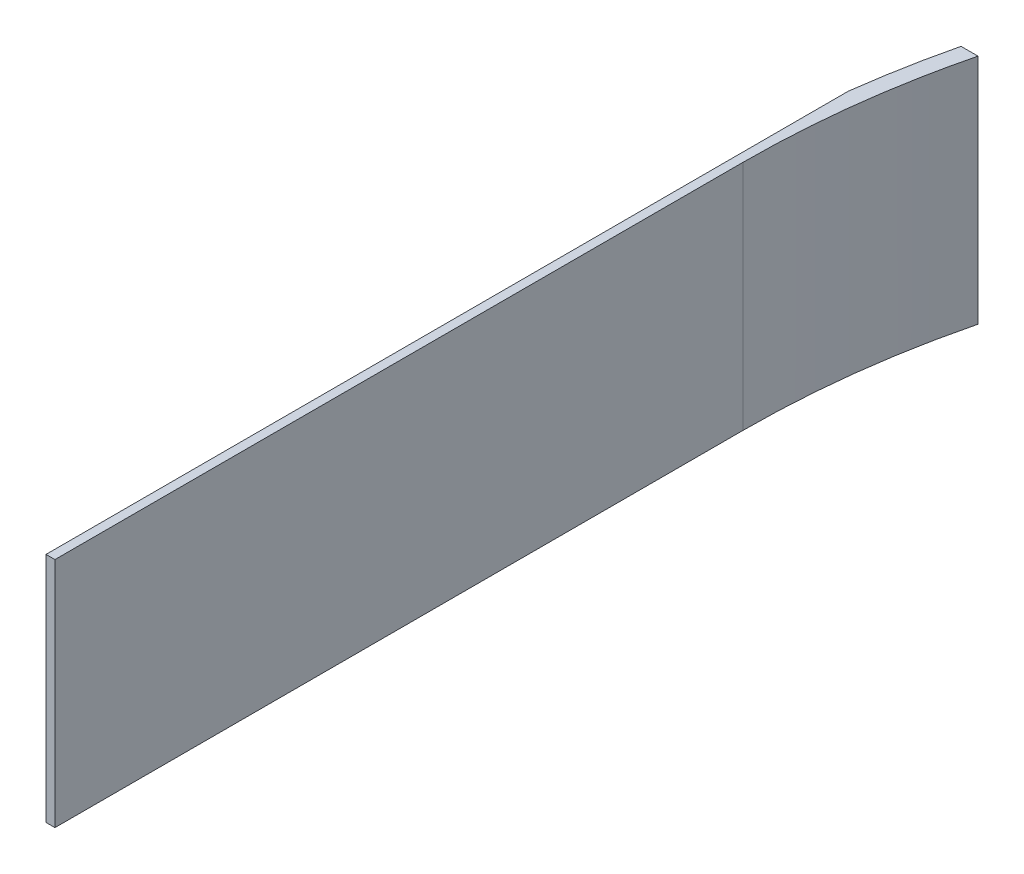
ISO-10303-21;
HEADER;
FILE_DESCRIPTION(('STEP AP214'),'2;1');
FILE_NAME('part.step','',(''),(''),'','','');
FILE_SCHEMA(('AUTOMOTIVE_DESIGN { 1 0 10303 214 1 1 1 1 }'));
ENDSEC;
DATA;
#1=APPLICATION_CONTEXT('core data for automotive mechanical design processes');
#2=APPLICATION_PROTOCOL_DEFINITION('international standard','automotive_design',2000,#1);
#3=PRODUCT_CONTEXT('',#1,'mechanical');
#4=PRODUCT('Part','Part','',(#3));
#5=PRODUCT_RELATED_PRODUCT_CATEGORY('part','',(#4));
#6=PRODUCT_DEFINITION_FORMATION('','',#4);
#7=PRODUCT_DEFINITION_CONTEXT('part definition',#1,'design');
#8=PRODUCT_DEFINITION('design','',#6,#7);
#9=PRODUCT_DEFINITION_SHAPE('','',#8);
#10=(LENGTH_UNIT() NAMED_UNIT(*) SI_UNIT(.MILLI.,.METRE.));
#11=(NAMED_UNIT(*) PLANE_ANGLE_UNIT() SI_UNIT($,.RADIAN.));
#12=(NAMED_UNIT(*) SI_UNIT($,.STERADIAN.) SOLID_ANGLE_UNIT());
#13=UNCERTAINTY_MEASURE_WITH_UNIT(LENGTH_MEASURE(1.E-05),#10,'distance_accuracy_value','');
#14=(GEOMETRIC_REPRESENTATION_CONTEXT(3) GLOBAL_UNCERTAINTY_ASSIGNED_CONTEXT((#13)) GLOBAL_UNIT_ASSIGNED_CONTEXT((#10,
#11,#12)) REPRESENTATION_CONTEXT('',''));
#15=CARTESIAN_POINT('',(0.,0.,0.));
#16=DIRECTION('',(0.,0.,1.));
#17=DIRECTION('',(1.,0.,0.));
#18=AXIS2_PLACEMENT_3D('',#15,#16,#17);
#19=CARTESIAN_POINT('',(-300.,0.,0.));
#20=DIRECTION('',(1.,0.,0.));
#21=DIRECTION('',(0.,0.,-1.));
#22=AXIS2_PLACEMENT_3D('',#19,#20,#21);
#23=PLANE('',#22);
#24=DIRECTION('',(0.,-1.,0.));
#25=VECTOR('',#24,1.);
#26=CARTESIAN_POINT('',(-300.,0.,0.));
#27=LINE('',#26,#25);
#28=CARTESIAN_POINT('',(-300.,116.56754481445,0.));
#29=VERTEX_POINT('',#28);
#30=CARTESIAN_POINT('',(-300.,77.7625120885841,0.));
#31=VERTEX_POINT('',#30);
#32=EDGE_CURVE('E11',#29,#31,#27,.T.);
#33=ORIENTED_EDGE('',*,*,#32,.F.);
#34=DIRECTION('',(0.,0.,1.));
#35=VECTOR('',#34,1.);
#36=CARTESIAN_POINT('',(-300.,116.56754481445,230.000026632189));
#37=LINE('',#36,#35);
#38=CARTESIAN_POINT('',(-300.,116.56754481445,-134.047206857874));
#39=VERTEX_POINT('',#38);
#40=EDGE_CURVE('E109',#39,#29,#37,.T.);
#41=ORIENTED_EDGE('',*,*,#40,.F.);
#42=DIRECTION('',(0.,-1.,0.));
#43=VECTOR('',#42,1.);
#44=CARTESIAN_POINT('',(-300.,103.299199319842,-134.047206857874));
#45=LINE('',#44,#43);
#46=CARTESIAN_POINT('',(-300.,80.1625120885841,-134.047206857874));
#47=VERTEX_POINT('',#46);
#48=EDGE_CURVE('E97',#47,#39,#45,.F.);
#49=ORIENTED_EDGE('',*,*,#48,.F.);
#50=DIRECTION('',(0.,0.,-1.));
#51=VECTOR('',#50,1.);
#52=CARTESIAN_POINT('',(-300.,80.1625120885842,-208.339640738144));
#53=LINE('',#52,#51);
#54=CARTESIAN_POINT('',(-300.,80.1625120885842,-149.999999999977));
#55=VERTEX_POINT('',#54);
#56=EDGE_CURVE('E140',#47,#55,#53,.T.);
#57=ORIENTED_EDGE('',*,*,#56,.T.);
#58=DIRECTION('',(0.,-1.,0.));
#59=VECTOR('',#58,1.);
#60=CARTESIAN_POINT('',(-300.,0.,-150.));
#61=LINE('',#60,#59);
#62=CARTESIAN_POINT('',(-300.,77.7625120885841,-149.999999999977));
#63=VERTEX_POINT('',#62);
#64=EDGE_CURVE('E38',#55,#63,#61,.T.);
#65=ORIENTED_EDGE('',*,*,#64,.T.);
#66=DIRECTION('',(0.,0.,-1.));
#67=VECTOR('',#66,1.);
#68=CARTESIAN_POINT('',(-300.,77.7625120885841,-149.499973367811));
#69=LINE('',#68,#67);
#70=EDGE_CURVE('E150',#31,#63,#69,.T.);
#71=ORIENTED_EDGE('',*,*,#70,.F.);
#72=EDGE_LOOP('',(#33,#41,#49,#57,#65,#71));
#73=FACE_BOUND('',#72,.T.);
#74=ADVANCED_FACE('F34',(#73),#23,.F.);
#75=CARTESIAN_POINT('',(0.,0.,-150.));
#76=DIRECTION('',(0.,0.,1.));
#77=DIRECTION('',(1.,0.,0.));
#78=AXIS2_PLACEMENT_3D('',#75,#76,#77);
#79=PLANE('',#78);
#80=ORIENTED_EDGE('',*,*,#64,.F.);
#81=DIRECTION('',(1.,0.,0.));
#82=VECTOR('',#81,1.);
#83=CARTESIAN_POINT('',(-262.506364446809,80.1625120885842,-150.));
#84=LINE('',#83,#82);
#85=CARTESIAN_POINT('',(-297.067108031725,80.1625120885842,-150.));
#86=VERTEX_POINT('',#85);
#87=EDGE_CURVE('E137',#55,#86,#84,.T.);
#88=ORIENTED_EDGE('',*,*,#87,.T.);
#89=DIRECTION('',(0.,-1.,0.));
#90=VECTOR('',#89,1.);
#91=CARTESIAN_POINT('',(-297.067108031725,103.299199319842,-150.));
#92=LINE('',#91,#90);
#93=CARTESIAN_POINT('',(-297.067108031725,116.56754481445,-150.));
#94=VERTEX_POINT('',#93);
#95=EDGE_CURVE('E106',#94,#86,#92,.T.);
#96=ORIENTED_EDGE('',*,*,#95,.F.);
#97=DIRECTION('',(-1.,0.,0.));
#98=VECTOR('',#97,1.);
#99=CARTESIAN_POINT('',(-253.506364446809,116.56754481445,-150.));
#100=LINE('',#99,#98);
#101=CARTESIAN_POINT('',(-294.23684504918,116.56754481445,-149.999999999997));
#102=VERTEX_POINT('',#101);
#103=EDGE_CURVE('E111',#102,#94,#100,.T.);
#104=ORIENTED_EDGE('',*,*,#103,.F.);
#105=DIRECTION('',(0.,-1.,0.));
#106=VECTOR('',#105,1.);
#107=CARTESIAN_POINT('',(-294.236845049179,102.739630130056,-150.));
#108=LINE('',#107,#106);
#109=CARTESIAN_POINT('',(-294.236845049179,77.7625120885842,-150.));
#110=VERTEX_POINT('',#109);
#111=EDGE_CURVE('E143',#102,#110,#108,.T.);
#112=ORIENTED_EDGE('',*,*,#111,.T.);
#113=DIRECTION('',(1.,0.,0.));
#114=VECTOR('',#113,1.);
#115=CARTESIAN_POINT('',(-308.554799780113,77.7625120885841,-150.));
#116=LINE('',#115,#114);
#117=EDGE_CURVE('E136',#63,#110,#116,.T.);
#118=ORIENTED_EDGE('',*,*,#117,.F.);
#119=EDGE_LOOP('',(#80,#88,#96,#104,#112,#118));
#120=FACE_BOUND('',#119,.T.);
#121=ADVANCED_FACE('F152',(#120),#79,.F.);
#122=CARTESIAN_POINT('',(0.,0.,0.));
#123=DIRECTION('',(0.,0.,1.));
#124=DIRECTION('',(1.,0.,0.));
#125=AXIS2_PLACEMENT_3D('',#122,#123,#124);
#126=PLANE('',#125);
#127=ORIENTED_EDGE('',*,*,#32,.T.);
#128=DIRECTION('',(1.,0.,0.));
#129=VECTOR('',#128,1.);
#130=CARTESIAN_POINT('',(-308.554799780113,77.7625120885841,0.));
#131=LINE('',#130,#129);
#132=CARTESIAN_POINT('',(-298.506364446809,77.7625120885841,0.));
#133=VERTEX_POINT('',#132);
#134=EDGE_CURVE('E133',#31,#133,#131,.T.);
#135=ORIENTED_EDGE('',*,*,#134,.T.);
#136=DIRECTION('',(0.,-1.,0.));
#137=VECTOR('',#136,1.);
#138=CARTESIAN_POINT('',(-298.506364446809,329.118910613293,0.));
#139=LINE('',#138,#137);
#140=CARTESIAN_POINT('',(-298.506364446809,116.56754481445,0.));
#141=VERTEX_POINT('',#140);
#142=EDGE_CURVE('E156',#141,#133,#139,.T.);
#143=ORIENTED_EDGE('',*,*,#142,.F.);
#144=DIRECTION('',(-1.,0.,0.));
#145=VECTOR('',#144,1.);
#146=CARTESIAN_POINT('',(-253.506364446809,116.56754481445,0.));
#147=LINE('',#146,#145);
#148=EDGE_CURVE('E142',#141,#29,#147,.T.);
#149=ORIENTED_EDGE('',*,*,#148,.T.);
#150=EDGE_LOOP('',(#127,#135,#143,#149));
#151=FACE_BOUND('',#150,.T.);
#152=ADVANCED_FACE('F178',(#151),#126,.T.);
#153=CARTESIAN_POINT('',(-308.554799780113,77.7625120885841,-149.499973367811));
#154=DIRECTION('',(0.,1.,0.));
#155=DIRECTION('',(-1.,0.,0.));
#156=AXIS2_PLACEMENT_3D('',#153,#154,#155);
#157=PLANE('',#156);
#158=ORIENTED_EDGE('',*,*,#134,.F.);
#159=ORIENTED_EDGE('',*,*,#70,.T.);
#160=ORIENTED_EDGE('',*,*,#117,.T.);
#161=CARTESIAN_POINT('',(-261.079419288202,77.7625120885841,-208.339640738144));
#162=CARTESIAN_POINT('',(-285.043285040561,77.7625120885842,-186.302030181662));
#163=CARTESIAN_POINT('',(-298.506364446809,77.7625120885842,-152.726237441052));
#164=CARTESIAN_POINT('',(-298.506364446809,77.7625120885842,-114.999973367811));
#165=(BOUNDED_CURVE() B_SPLINE_CURVE(3,(#161,#162,#163,#164),.UNSPECIFIED.,.F.,
.F.) B_SPLINE_CURVE_WITH_KNOTS((4,4),(0.,1.),
.UNSPECIFIED.) CURVE() GEOMETRIC_REPRESENTATION_ITEM() RATIONAL_B_SPLINE_CURVE((1.,
0.92665637702562,0.92665637702562,1.)) REPRESENTATION_ITEM(''));
#166=CARTESIAN_POINT('',(-298.506364446809,77.7625120885841,-114.999973367811));
#167=VERTEX_POINT('',#166);
#168=EDGE_CURVE('E132',#167,#110,#165,.F.);
#169=ORIENTED_EDGE('',*,*,#168,.F.);
#170=DIRECTION('',(0.,0.,-1.));
#171=VECTOR('',#170,1.);
#172=CARTESIAN_POINT('',(-298.506364446809,77.7625120885841,-149.499973367811));
#173=LINE('',#172,#171);
#174=EDGE_CURVE('E58',#133,#167,#173,.T.);
#175=ORIENTED_EDGE('',*,*,#174,.F.);
#176=EDGE_LOOP('',(#158,#159,#160,#169,#175));
#177=FACE_BOUND('',#176,.T.);
#178=ADVANCED_FACE('F187',(#177),#157,.F.);
#179=CARTESIAN_POINT('',(-298.506364446809,329.118910613293,-114.999973367811));
#180=DIRECTION('',(1.,0.,0.));
#181=DIRECTION('',(0.,0.,-1.));
#182=AXIS2_PLACEMENT_3D('',#179,#180,#181);
#183=PLANE('',#182);
#184=DIRECTION('',(0.,0.,-1.));
#185=VECTOR('',#184,1.);
#186=CARTESIAN_POINT('',(-298.506364446809,116.56754481445,-114.999973367811));
#187=LINE('',#186,#185);
#188=CARTESIAN_POINT('',(-298.506364446809,116.56754481445,-114.999973367811));
#189=VERTEX_POINT('',#188);
#190=EDGE_CURVE('E43',#141,#189,#187,.T.);
#191=ORIENTED_EDGE('',*,*,#190,.F.);
#192=ORIENTED_EDGE('',*,*,#142,.T.);
#193=ORIENTED_EDGE('',*,*,#174,.T.);
#194=DIRECTION('',(0.,-1.,0.));
#195=VECTOR('',#194,1.);
#196=CARTESIAN_POINT('',(-298.506364446809,329.118910613293,-114.999973367811));
#197=LINE('',#196,#195);
#198=EDGE_CURVE('E105',#189,#167,#197,.T.);
#199=ORIENTED_EDGE('',*,*,#198,.F.);
#200=EDGE_LOOP('',(#191,#192,#193,#199));
#201=FACE_BOUND('',#200,.T.);
#202=ADVANCED_FACE('F191',(#201),#183,.T.);
#203=CARTESIAN_POINT('',(-262.506364446809,80.1625120885842,-208.339640738144));
#204=DIRECTION('',(0.,1.,0.));
#205=DIRECTION('',(0.,0.,1.));
#206=AXIS2_PLACEMENT_3D('',#203,#204,#205);
#207=PLANE('',#206);
#208=ORIENTED_EDGE('',*,*,#87,.F.);
#209=ORIENTED_EDGE('',*,*,#56,.F.);
#210=CARTESIAN_POINT('',(-264.345443359509,80.1625120885842,-209.549375240456));
#211=CARTESIAN_POINT('',(-287.995393539431,80.1625120885842,-186.744885874244));
#212=CARTESIAN_POINT('',(-301.206364446809,80.1625120885842,-152.858337177016));
#213=CARTESIAN_POINT('',(-301.206364446809,80.1625120885841,-114.999973367811));
#214=(BOUNDED_CURVE() B_SPLINE_CURVE(3,(#210,#211,#212,#213),.UNSPECIFIED.,.F.,
.F.) B_SPLINE_CURVE_WITH_KNOTS((4,4),(0.,1.),
.UNSPECIFIED.) CURVE() GEOMETRIC_REPRESENTATION_ITEM() RATIONAL_B_SPLINE_CURVE((1.,
0.930058341806269,0.930058341806269,1.)) REPRESENTATION_ITEM(''));
#215=EDGE_CURVE('E103',#47,#86,#214,.F.);
#216=ORIENTED_EDGE('',*,*,#215,.T.);
#217=EDGE_LOOP('',(#208,#209,#216));
#218=FACE_BOUND('',#217,.T.);
#219=ADVANCED_FACE('F193',(#218),#207,.T.);
#220=CARTESIAN_POINT('',(-253.506364446809,116.56754481445,230.000026632189));
#221=DIRECTION('',(0.,-1.,0.));
#222=DIRECTION('',(1.,0.,0.));
#223=AXIS2_PLACEMENT_3D('',#220,#221,#222);
#224=PLANE('',#223);
#225=CARTESIAN_POINT('',(-298.506364446809,116.56754481445,-114.999973367811));
#226=CARTESIAN_POINT('',(-298.506364446809,116.56754481445,-157.092894803021));
#227=CARTESIAN_POINT('',(-282.03522127651,116.56754481445,-193.546434085416));
#228=CARTESIAN_POINT('',(-253.506364446809,116.56754481445,-214.592894803022));
#229=(BOUNDED_CURVE() B_SPLINE_CURVE(3,(#225,#226,#227,#228),.UNSPECIFIED.,.F.,
.F.) B_SPLINE_CURVE_WITH_KNOTS((4,4),(0.,1.),
.UNSPECIFIED.) CURVE() GEOMETRIC_REPRESENTATION_ITEM() RATIONAL_B_SPLINE_CURVE((1.,
0.910683602522959,0.910683602522959,1.)) REPRESENTATION_ITEM(''));
#230=EDGE_CURVE('E115',#189,#102,#229,.T.);
#231=ORIENTED_EDGE('',*,*,#230,.T.);
#232=ORIENTED_EDGE('',*,*,#103,.T.);
#233=CARTESIAN_POINT('',(-301.206364446809,116.56754481445,-114.999973367811));
#234=CARTESIAN_POINT('',(-301.206364446809,116.56754481445,-159.118652957297));
#235=CARTESIAN_POINT('',(-283.692922793391,116.56754481445,-197.140622652278));
#236=CARTESIAN_POINT('',(-253.506364446809,116.56754481445,-218.557457404456));
#237=(BOUNDED_CURVE() B_SPLINE_CURVE(3,(#233,#234,#235,#236),.UNSPECIFIED.,.F.,
.F.) B_SPLINE_CURVE_WITH_KNOTS((4,4),(0.,1.),
.UNSPECIFIED.) CURVE() GEOMETRIC_REPRESENTATION_ITEM() RATIONAL_B_SPLINE_CURVE((1.,
0.907874095489197,0.907874095489197,1.)) REPRESENTATION_ITEM(''));
#238=EDGE_CURVE('E101',#39,#94,#237,.T.);
#239=ORIENTED_EDGE('',*,*,#238,.F.);
#240=ORIENTED_EDGE('',*,*,#40,.T.);
#241=ORIENTED_EDGE('',*,*,#148,.F.);
#242=ORIENTED_EDGE('',*,*,#190,.T.);
#243=EDGE_LOOP('',(#231,#232,#239,#240,#241,#242));
#244=FACE_BOUND('',#243,.T.);
#245=ADVANCED_FACE('F36',(#244),#224,.F.);
#246=CARTESIAN_POINT('',(-208.506364446809,329.118910613293,-233.449973367811));
#247=CARTESIAN_POINT('',(-23.1063644468091,329.118910613293,-233.449973367811));
#248=CARTESIAN_POINT('',(-23.1063644468091,329.118910613293,3.4500266321889));
#249=CARTESIAN_POINT('',(-208.506364446809,329.118910613293,3.45002663218892));
#250=CARTESIAN_POINT('',(-393.906364446809,329.118910613293,3.45002663218896));
#251=CARTESIAN_POINT('',(-393.906364446809,329.118910613293,-233.449973367811));
#252=CARTESIAN_POINT('',(-208.506364446809,329.118910613293,-233.449973367811));
#253=(BOUNDED_CURVE() B_SPLINE_CURVE(3,(#246,#247,#248,#249,#250,#251,#252),.UNSPECIFIED.,.T.,
.F.) B_SPLINE_CURVE_WITH_KNOTS((4,3,4),(0.,0.5,1.),
.UNSPECIFIED.) CURVE() GEOMETRIC_REPRESENTATION_ITEM() RATIONAL_B_SPLINE_CURVE((1.,
0.333333333333333,0.333333333333333,1.,0.333333333333333,0.333333333333333,1.)) REPRESENTATION_ITEM(''));
#254=DIRECTION('',(0.,-1.,0.));
#255=VECTOR('',#254,1.);
#256=SURFACE_OF_LINEAR_EXTRUSION('',#253,#255);
#257=ORIENTED_EDGE('',*,*,#238,.T.);
#258=ORIENTED_EDGE('',*,*,#95,.T.);
#259=ORIENTED_EDGE('',*,*,#215,.F.);
#260=ORIENTED_EDGE('',*,*,#48,.T.);
#261=EDGE_LOOP('',(#257,#258,#259,#260));
#262=FACE_BOUND('',#261,.T.);
#263=ADVANCED_FACE('F99',(#262),#256,.T.);
#264=CARTESIAN_POINT('',(-208.506364446809,329.118910613293,-229.999973367811));
#265=CARTESIAN_POINT('',(-28.5063644468092,329.118910613293,-229.999973367811));
#266=CARTESIAN_POINT('',(-28.5063644468092,329.118910613293,2.66321888917065E-05));
#267=CARTESIAN_POINT('',(-208.506364446809,329.118910613293,2.6632188926401E-05));
#268=CARTESIAN_POINT('',(-388.506364446809,329.118910613293,2.66321889541565E-05));
#269=CARTESIAN_POINT('',(-388.506364446809,329.118910613293,-229.999973367811));
#270=CARTESIAN_POINT('',(-208.506364446809,329.118910613293,-229.999973367811));
#271=(BOUNDED_CURVE() B_SPLINE_CURVE(3,(#264,#265,#266,#267,#268,#269,#270),.UNSPECIFIED.,.T.,
.F.) B_SPLINE_CURVE_WITH_KNOTS((4,3,4),(0.,0.5,1.),
.UNSPECIFIED.) CURVE() GEOMETRIC_REPRESENTATION_ITEM() RATIONAL_B_SPLINE_CURVE((1.,
0.333333333333333,0.333333333333333,1.,0.333333333333333,0.333333333333333,1.)) REPRESENTATION_ITEM(''));
#272=DIRECTION('',(0.,-1.,0.));
#273=VECTOR('',#272,1.);
#274=SURFACE_OF_LINEAR_EXTRUSION('',#271,#273);
#275=ORIENTED_EDGE('',*,*,#111,.F.);
#276=ORIENTED_EDGE('',*,*,#230,.F.);
#277=ORIENTED_EDGE('',*,*,#198,.T.);
#278=ORIENTED_EDGE('',*,*,#168,.T.);
#279=EDGE_LOOP('',(#275,#276,#277,#278));
#280=FACE_BOUND('',#279,.T.);
#281=ADVANCED_FACE('F174',(#280),#274,.F.);
#282=CLOSED_SHELL('',(#74,#121,#152,#178,#202,#219,#245,#263,#281));
#283=MANIFOLD_SOLID_BREP('B2',#282);
#284=ADVANCED_BREP_SHAPE_REPRESENTATION('',(#18,#283),#14);
#285=SHAPE_DEFINITION_REPRESENTATION(#9,#284);
ENDSEC;
END-ISO-10303-21;
